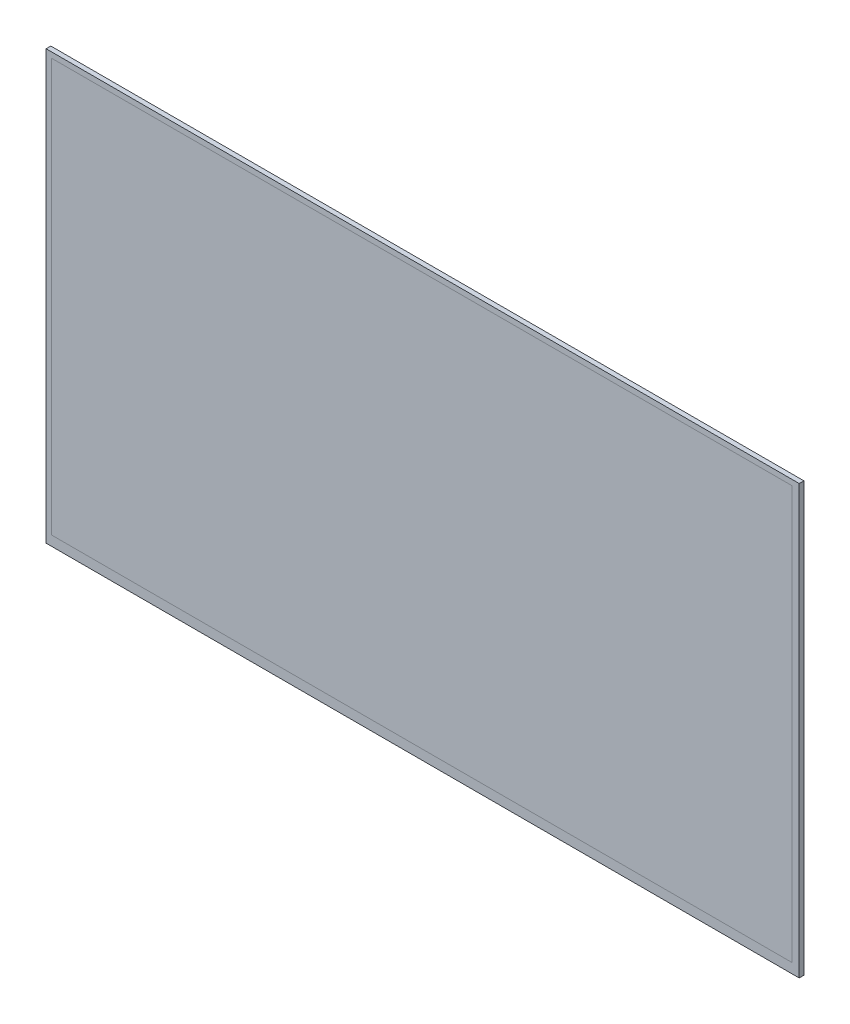
ISO-10303-21;
HEADER;
FILE_DESCRIPTION(('STEP AP214'),'2;1');
FILE_NAME('part.step','',(''),(''),'','','');
FILE_SCHEMA(('AUTOMOTIVE_DESIGN { 1 0 10303 214 1 1 1 1 }'));
ENDSEC;
DATA;
#1=APPLICATION_CONTEXT('core data for automotive mechanical design processes');
#2=APPLICATION_PROTOCOL_DEFINITION('international standard','automotive_design',2000,#1);
#3=PRODUCT_CONTEXT('',#1,'mechanical');
#4=PRODUCT('Part','Part','',(#3));
#5=PRODUCT_RELATED_PRODUCT_CATEGORY('part','',(#4));
#6=PRODUCT_DEFINITION_FORMATION('','',#4);
#7=PRODUCT_DEFINITION_CONTEXT('part definition',#1,'design');
#8=PRODUCT_DEFINITION('design','',#6,#7);
#9=PRODUCT_DEFINITION_SHAPE('','',#8);
#10=(LENGTH_UNIT() NAMED_UNIT(*) SI_UNIT(.MILLI.,.METRE.));
#11=(NAMED_UNIT(*) PLANE_ANGLE_UNIT() SI_UNIT($,.RADIAN.));
#12=(NAMED_UNIT(*) SI_UNIT($,.STERADIAN.) SOLID_ANGLE_UNIT());
#13=UNCERTAINTY_MEASURE_WITH_UNIT(LENGTH_MEASURE(1.E-05),#10,'distance_accuracy_value','');
#14=(GEOMETRIC_REPRESENTATION_CONTEXT(3) GLOBAL_UNCERTAINTY_ASSIGNED_CONTEXT((#13)) GLOBAL_UNIT_ASSIGNED_CONTEXT((#10,
#11,#12)) REPRESENTATION_CONTEXT('',''));
#15=CARTESIAN_POINT('',(0.,0.,0.));
#16=DIRECTION('',(0.,0.,1.));
#17=DIRECTION('',(1.,0.,0.));
#18=AXIS2_PLACEMENT_3D('',#15,#16,#17);
#19=CARTESIAN_POINT('',(-103.470930517839,-70.1245119393201,0.48));
#20=DIRECTION('',(0.,0.,1.));
#21=DIRECTION('',(1.,0.,0.));
#22=AXIS2_PLACEMENT_3D('',#19,#20,#21);
#23=PLANE('',#22);
#24=DIRECTION('',(0.,1.,0.));
#25=VECTOR('',#24,1.);
#26=CARTESIAN_POINT('',(50.6090694821613,15.7954880606799,0.48));
#27=LINE('',#26,#25);
#28=CARTESIAN_POINT('',(50.6090694821613,-70.1245119393201,0.48));
#29=VERTEX_POINT('',#28);
#30=CARTESIAN_POINT('',(50.6090694821613,15.7954880606799,0.48));
#31=VERTEX_POINT('',#30);
#32=EDGE_CURVE('P0_E96',#29,#31,#27,.T.);
#33=ORIENTED_EDGE('',*,*,#32,.T.);
#34=DIRECTION('',(1.,0.,0.));
#35=VECTOR('',#34,1.);
#36=CARTESIAN_POINT('',(-103.470930517839,15.7954880606799,0.48));
#37=LINE('',#36,#35);
#38=CARTESIAN_POINT('',(-103.470930517839,15.7954880606799,0.48));
#39=VERTEX_POINT('',#38);
#40=EDGE_CURVE('P0_E80',#31,#39,#37,.F.);
#41=ORIENTED_EDGE('',*,*,#40,.T.);
#42=DIRECTION('',(0.,1.,0.));
#43=VECTOR('',#42,1.);
#44=CARTESIAN_POINT('',(-103.470930517839,15.7954880606799,0.48));
#45=LINE('',#44,#43);
#46=CARTESIAN_POINT('',(-103.470930517839,-70.1245119393201,0.48));
#47=VERTEX_POINT('',#46);
#48=EDGE_CURVE('P0_E20',#39,#47,#45,.F.);
#49=ORIENTED_EDGE('',*,*,#48,.T.);
#50=DIRECTION('',(1.,0.,0.));
#51=VECTOR('',#50,1.);
#52=CARTESIAN_POINT('',(-103.470930517839,-70.1245119393201,0.48));
#53=LINE('',#52,#51);
#54=EDGE_CURVE('P0_E104',#47,#29,#53,.T.);
#55=ORIENTED_EDGE('',*,*,#54,.T.);
#56=EDGE_LOOP('',(#33,#41,#49,#55));
#57=FACE_BOUND('',#56,.T.);
#58=ADVANCED_FACE('P0_F17',(#57),#23,.T.);
#59=CARTESIAN_POINT('',(-103.470930517839,15.7954880606799,0.48));
#60=DIRECTION('',(-1.,0.,0.));
#61=DIRECTION('',(0.,0.,1.));
#62=AXIS2_PLACEMENT_3D('',#59,#60,#61);
#63=PLANE('',#62);
#64=DIRECTION('',(0.,0.,-1.));
#65=VECTOR('',#64,1.);
#66=CARTESIAN_POINT('',(-103.470930517839,-70.1245119393201,0.48));
#67=LINE('',#66,#65);
#68=CARTESIAN_POINT('',(-103.470930517839,-70.1245119393201,0.98));
#69=VERTEX_POINT('',#68);
#70=EDGE_CURVE('P0_E90',#69,#47,#67,.T.);
#71=ORIENTED_EDGE('',*,*,#70,.T.);
#72=ORIENTED_EDGE('',*,*,#48,.F.);
#73=DIRECTION('',(0.,0.,1.));
#74=VECTOR('',#73,1.);
#75=CARTESIAN_POINT('',(-103.470930517839,15.7954880606799,0.48));
#76=LINE('',#75,#74);
#77=CARTESIAN_POINT('',(-103.470930517839,15.7954880606799,0.98));
#78=VERTEX_POINT('',#77);
#79=EDGE_CURVE('P0_E88',#39,#78,#76,.T.);
#80=ORIENTED_EDGE('',*,*,#79,.T.);
#81=DIRECTION('',(0.,1.,0.));
#82=VECTOR('',#81,1.);
#83=CARTESIAN_POINT('',(-103.470930517839,-72.1645119393201,0.98));
#84=LINE('',#83,#82);
#85=EDGE_CURVE('P0_E109',#69,#78,#84,.T.);
#86=ORIENTED_EDGE('',*,*,#85,.F.);
#87=EDGE_LOOP('',(#71,#72,#80,#86));
#88=FACE_BOUND('',#87,.T.);
#89=ADVANCED_FACE('P0_F86',(#88),#63,.F.);
#90=CARTESIAN_POINT('',(-103.470930517839,15.7954880606799,0.48));
#91=DIRECTION('',(0.,1.,0.));
#92=DIRECTION('',(0.,0.,1.));
#93=AXIS2_PLACEMENT_3D('',#90,#91,#92);
#94=PLANE('',#93);
#95=ORIENTED_EDGE('',*,*,#79,.F.);
#96=ORIENTED_EDGE('',*,*,#40,.F.);
#97=DIRECTION('',(0.,0.,1.));
#98=VECTOR('',#97,1.);
#99=CARTESIAN_POINT('',(50.6090694821613,15.7954880606799,0.48));
#100=LINE('',#99,#98);
#101=CARTESIAN_POINT('',(50.6090694821613,15.7954880606799,0.98));
#102=VERTEX_POINT('',#101);
#103=EDGE_CURVE('P0_E101',#31,#102,#100,.T.);
#104=ORIENTED_EDGE('',*,*,#103,.T.);
#105=DIRECTION('',(1.,0.,0.));
#106=VECTOR('',#105,1.);
#107=CARTESIAN_POINT('',(-104.580930517839,15.7954880606799,0.98));
#108=LINE('',#107,#106);
#109=EDGE_CURVE('P0_E95',#78,#102,#108,.T.);
#110=ORIENTED_EDGE('',*,*,#109,.F.);
#111=EDGE_LOOP('',(#95,#96,#104,#110));
#112=FACE_BOUND('',#111,.T.);
#113=ADVANCED_FACE('P0_F94',(#112),#94,.F.);
#114=CARTESIAN_POINT('',(50.6090694821613,15.7954880606799,0.48));
#115=DIRECTION('',(1.,0.,0.));
#116=DIRECTION('',(0.,1.,0.));
#117=AXIS2_PLACEMENT_3D('',#114,#115,#116);
#118=PLANE('',#117);
#119=ORIENTED_EDGE('',*,*,#103,.F.);
#120=ORIENTED_EDGE('',*,*,#32,.F.);
#121=DIRECTION('',(0.,0.,-1.));
#122=VECTOR('',#121,1.);
#123=CARTESIAN_POINT('',(50.6090694821613,-70.1245119393201,0.48));
#124=LINE('',#123,#122);
#125=CARTESIAN_POINT('',(50.6090694821613,-70.1245119393201,0.98));
#126=VERTEX_POINT('',#125);
#127=EDGE_CURVE('P0_E106',#29,#126,#124,.F.);
#128=ORIENTED_EDGE('',*,*,#127,.T.);
#129=DIRECTION('',(0.,1.,0.));
#130=VECTOR('',#129,1.);
#131=CARTESIAN_POINT('',(50.6090694821613,-72.1645119393201,0.98));
#132=LINE('',#131,#130);
#133=EDGE_CURVE('P0_E112',#102,#126,#132,.F.);
#134=ORIENTED_EDGE('',*,*,#133,.F.);
#135=EDGE_LOOP('',(#119,#120,#128,#134));
#136=FACE_BOUND('',#135,.T.);
#137=ADVANCED_FACE('P0_F178',(#136),#118,.F.);
#138=CARTESIAN_POINT('',(-103.470930517839,-70.1245119393201,0.48));
#139=DIRECTION('',(0.,-1.,0.));
#140=DIRECTION('',(0.,0.,-1.));
#141=AXIS2_PLACEMENT_3D('',#138,#139,#140);
#142=PLANE('',#141);
#143=ORIENTED_EDGE('',*,*,#127,.F.);
#144=ORIENTED_EDGE('',*,*,#54,.F.);
#145=ORIENTED_EDGE('',*,*,#70,.F.);
#146=DIRECTION('',(1.,0.,0.));
#147=VECTOR('',#146,1.);
#148=CARTESIAN_POINT('',(-104.580930517839,-70.1245119393201,0.98));
#149=LINE('',#148,#147);
#150=EDGE_CURVE('P0_E114',#126,#69,#149,.F.);
#151=ORIENTED_EDGE('',*,*,#150,.F.);
#152=EDGE_LOOP('',(#143,#144,#145,#151));
#153=FACE_BOUND('',#152,.T.);
#154=ADVANCED_FACE('P0_F174',(#153),#142,.F.);
#155=CARTESIAN_POINT('',(-104.580930517839,-72.1645119393201,0.98));
#156=DIRECTION('',(0.,0.,1.));
#157=DIRECTION('',(1.,0.,0.));
#158=AXIS2_PLACEMENT_3D('',#155,#156,#157);
#159=PLANE('',#158);
#160=DIRECTION('',(0.,-1.,0.));
#161=VECTOR('',#160,1.);
#162=CARTESIAN_POINT('',(52.1190694821613,16.9354880606799,0.98));
#163=LINE('',#162,#161);
#164=CARTESIAN_POINT('',(52.1190694821613,-72.1645119393201,0.98));
#165=VERTEX_POINT('',#164);
#166=CARTESIAN_POINT('',(52.1190694821613,16.9354880606799,0.98));
#167=VERTEX_POINT('',#166);
#168=EDGE_CURVE('P0_E122',#165,#167,#163,.F.);
#169=ORIENTED_EDGE('',*,*,#168,.T.);
#170=DIRECTION('',(1.,0.,0.));
#171=VECTOR('',#170,1.);
#172=CARTESIAN_POINT('',(-104.580930517839,16.9354880606799,0.98));
#173=LINE('',#172,#171);
#174=CARTESIAN_POINT('',(-104.580930517839,16.9354880606799,0.98));
#175=VERTEX_POINT('',#174);
#176=EDGE_CURVE('P0_E127',#167,#175,#173,.F.);
#177=ORIENTED_EDGE('',*,*,#176,.T.);
#178=DIRECTION('',(0.,1.,0.));
#179=VECTOR('',#178,1.);
#180=CARTESIAN_POINT('',(-104.580930517839,16.9354880606799,0.98));
#181=LINE('',#180,#179);
#182=CARTESIAN_POINT('',(-104.580930517839,-72.1645119393201,0.98));
#183=VERTEX_POINT('',#182);
#184=EDGE_CURVE('P0_E130',#175,#183,#181,.F.);
#185=ORIENTED_EDGE('',*,*,#184,.T.);
#186=DIRECTION('',(1.,0.,0.));
#187=VECTOR('',#186,1.);
#188=CARTESIAN_POINT('',(-104.580930517839,-72.1645119393201,0.98));
#189=LINE('',#188,#187);
#190=EDGE_CURVE('P0_E117',#183,#165,#189,.T.);
#191=ORIENTED_EDGE('',*,*,#190,.T.);
#192=EDGE_LOOP('',(#169,#177,#185,#191));
#193=FACE_BOUND('',#192,.T.);
#194=ORIENTED_EDGE('',*,*,#133,.T.);
#195=ORIENTED_EDGE('',*,*,#150,.T.);
#196=ORIENTED_EDGE('',*,*,#85,.T.);
#197=ORIENTED_EDGE('',*,*,#109,.T.);
#198=EDGE_LOOP('',(#194,#195,#196,#197));
#199=FACE_BOUND('',#198,.T.);
#200=ADVANCED_FACE('P0_F171',(#193,#199),#159,.T.);
#201=CARTESIAN_POINT('',(-104.580930517839,-72.1645119393201,0.98));
#202=DIRECTION('',(0.,1.,0.));
#203=DIRECTION('',(0.,0.,1.));
#204=AXIS2_PLACEMENT_3D('',#201,#202,#203);
#205=PLANE('',#204);
#206=DIRECTION('',(0.,0.,1.));
#207=VECTOR('',#206,1.);
#208=CARTESIAN_POINT('',(52.1190694821613,-72.1645119393201,0.98));
#209=LINE('',#208,#207);
#210=CARTESIAN_POINT('',(52.1190694821613,-72.1645119393201,0.));
#211=VERTEX_POINT('',#210);
#212=EDGE_CURVE('P0_E119',#211,#165,#209,.T.);
#213=ORIENTED_EDGE('',*,*,#212,.T.);
#214=ORIENTED_EDGE('',*,*,#190,.F.);
#215=DIRECTION('',(0.,0.,1.));
#216=VECTOR('',#215,1.);
#217=CARTESIAN_POINT('',(-104.580930517839,-72.1645119393201,0.98));
#218=LINE('',#217,#216);
#219=CARTESIAN_POINT('',(-104.580930517839,-72.1645119393201,0.));
#220=VERTEX_POINT('',#219);
#221=EDGE_CURVE('P0_E133',#183,#220,#218,.F.);
#222=ORIENTED_EDGE('',*,*,#221,.T.);
#223=DIRECTION('',(1.,0.,0.));
#224=VECTOR('',#223,1.);
#225=CARTESIAN_POINT('',(-104.580930517839,-72.1645119393201,0.));
#226=LINE('',#225,#224);
#227=EDGE_CURVE('P0_E136',#220,#211,#226,.T.);
#228=ORIENTED_EDGE('',*,*,#227,.T.);
#229=EDGE_LOOP('',(#213,#214,#222,#228));
#230=FACE_BOUND('',#229,.T.);
#231=ADVANCED_FACE('P0_F154',(#230),#205,.F.);
#232=CARTESIAN_POINT('',(52.1190694821613,16.9354880606799,0.98));
#233=DIRECTION('',(-1.,0.,0.));
#234=DIRECTION('',(0.,-1.,0.));
#235=AXIS2_PLACEMENT_3D('',#232,#233,#234);
#236=PLANE('',#235);
#237=DIRECTION('',(0.,0.,-1.));
#238=VECTOR('',#237,1.);
#239=CARTESIAN_POINT('',(52.1190694821613,16.9354880606799,0.98));
#240=LINE('',#239,#238);
#241=CARTESIAN_POINT('',(52.1190694821613,16.9354880606799,0.));
#242=VERTEX_POINT('',#241);
#243=EDGE_CURVE('P0_E124',#242,#167,#240,.F.);
#244=ORIENTED_EDGE('',*,*,#243,.T.);
#245=ORIENTED_EDGE('',*,*,#168,.F.);
#246=ORIENTED_EDGE('',*,*,#212,.F.);
#247=DIRECTION('',(0.,1.,0.));
#248=VECTOR('',#247,1.);
#249=CARTESIAN_POINT('',(52.1190694821613,-72.1645119393201,0.));
#250=LINE('',#249,#248);
#251=EDGE_CURVE('P0_E139',#211,#242,#250,.T.);
#252=ORIENTED_EDGE('',*,*,#251,.T.);
#253=EDGE_LOOP('',(#244,#245,#246,#252));
#254=FACE_BOUND('',#253,.T.);
#255=ADVANCED_FACE('P0_F151',(#254),#236,.F.);
#256=CARTESIAN_POINT('',(-104.580930517839,16.9354880606799,0.98));
#257=DIRECTION('',(0.,-1.,0.));
#258=DIRECTION('',(0.,0.,-1.));
#259=AXIS2_PLACEMENT_3D('',#256,#257,#258);
#260=PLANE('',#259);
#261=DIRECTION('',(0.,0.,1.));
#262=VECTOR('',#261,1.);
#263=CARTESIAN_POINT('',(-104.580930517839,16.9354880606799,0.98));
#264=LINE('',#263,#262);
#265=CARTESIAN_POINT('',(-104.580930517839,16.9354880606799,0.));
#266=VERTEX_POINT('',#265);
#267=EDGE_CURVE('P0_E34',#266,#175,#264,.T.);
#268=ORIENTED_EDGE('',*,*,#267,.T.);
#269=ORIENTED_EDGE('',*,*,#176,.F.);
#270=ORIENTED_EDGE('',*,*,#243,.F.);
#271=DIRECTION('',(1.,0.,0.));
#272=VECTOR('',#271,1.);
#273=CARTESIAN_POINT('',(-104.580930517839,16.9354880606799,0.));
#274=LINE('',#273,#272);
#275=EDGE_CURVE('P0_E26',#242,#266,#274,.F.);
#276=ORIENTED_EDGE('',*,*,#275,.T.);
#277=EDGE_LOOP('',(#268,#269,#270,#276));
#278=FACE_BOUND('',#277,.T.);
#279=ADVANCED_FACE('P0_F145',(#278),#260,.F.);
#280=CARTESIAN_POINT('',(-104.580930517839,16.9354880606799,0.98));
#281=DIRECTION('',(1.,0.,0.));
#282=DIRECTION('',(0.,1.,0.));
#283=AXIS2_PLACEMENT_3D('',#280,#281,#282);
#284=PLANE('',#283);
#285=ORIENTED_EDGE('',*,*,#221,.F.);
#286=ORIENTED_EDGE('',*,*,#184,.F.);
#287=ORIENTED_EDGE('',*,*,#267,.F.);
#288=DIRECTION('',(0.,1.,0.));
#289=VECTOR('',#288,1.);
#290=CARTESIAN_POINT('',(-104.580930517839,-72.1645119393201,0.));
#291=LINE('',#290,#289);
#292=EDGE_CURVE('P0_E11',#266,#220,#291,.F.);
#293=ORIENTED_EDGE('',*,*,#292,.T.);
#294=EDGE_LOOP('',(#285,#286,#287,#293));
#295=FACE_BOUND('',#294,.T.);
#296=ADVANCED_FACE('P0_F156',(#295),#284,.F.);
#297=CARTESIAN_POINT('',(-104.580930517839,-72.1645119393201,0.));
#298=DIRECTION('',(0.,0.,1.));
#299=DIRECTION('',(1.,0.,0.));
#300=AXIS2_PLACEMENT_3D('',#297,#298,#299);
#301=PLANE('',#300);
#302=ORIENTED_EDGE('',*,*,#275,.F.);
#303=ORIENTED_EDGE('',*,*,#251,.F.);
#304=ORIENTED_EDGE('',*,*,#227,.F.);
#305=ORIENTED_EDGE('',*,*,#292,.F.);
#306=EDGE_LOOP('',(#302,#303,#304,#305));
#307=FACE_BOUND('',#306,.T.);
#308=ADVANCED_FACE('P0_F149',(#307),#301,.F.);
#309=CLOSED_SHELL('',(#58,#89,#113,#137,#154,#200,#231,#255,#279,#296,#308));
#310=MANIFOLD_SOLID_BREP('P0_B1',#309);
#311=CARTESIAN_POINT('',(-103.470930517839,-70.1245119393201,0.48));
#312=DIRECTION('',(0.,0.,1.));
#313=DIRECTION('',(1.,0.,0.));
#314=AXIS2_PLACEMENT_3D('',#311,#312,#313);
#315=PLANE('',#314);
#316=DIRECTION('',(1.,0.,0.));
#317=VECTOR('',#316,1.);
#318=CARTESIAN_POINT('',(-103.470930517839,15.7954880606799,0.48));
#319=LINE('',#318,#317);
#320=CARTESIAN_POINT('',(-103.470930517839,15.7954880606799,0.48));
#321=VERTEX_POINT('',#320);
#322=CARTESIAN_POINT('',(50.6090694821613,15.7954880606799,0.48));
#323=VERTEX_POINT('',#322);
#324=EDGE_CURVE('P1_E91',#321,#323,#319,.T.);
#325=ORIENTED_EDGE('',*,*,#324,.T.);
#326=DIRECTION('',(0.,1.,0.));
#327=VECTOR('',#326,1.);
#328=CARTESIAN_POINT('',(50.6090694821613,15.7954880606799,0.48));
#329=LINE('',#328,#327);
#330=CARTESIAN_POINT('',(50.6090694821613,-70.1245119393201,0.48));
#331=VERTEX_POINT('',#330);
#332=EDGE_CURVE('P1_E71',#323,#331,#329,.F.);
#333=ORIENTED_EDGE('',*,*,#332,.T.);
#334=DIRECTION('',(1.,0.,0.));
#335=VECTOR('',#334,1.);
#336=CARTESIAN_POINT('',(-103.470930517839,-70.1245119393201,0.48));
#337=LINE('',#336,#335);
#338=CARTESIAN_POINT('',(-103.470930517839,-70.1245119393201,0.48));
#339=VERTEX_POINT('',#338);
#340=EDGE_CURVE('P1_E57',#331,#339,#337,.F.);
#341=ORIENTED_EDGE('',*,*,#340,.T.);
#342=DIRECTION('',(0.,1.,0.));
#343=VECTOR('',#342,1.);
#344=CARTESIAN_POINT('',(-103.470930517839,15.7954880606799,0.48));
#345=LINE('',#344,#343);
#346=EDGE_CURVE('P1_E21',#339,#321,#345,.T.);
#347=ORIENTED_EDGE('',*,*,#346,.T.);
#348=EDGE_LOOP('',(#325,#333,#341,#347));
#349=FACE_BOUND('',#348,.T.);
#350=ADVANCED_FACE('P1_F18',(#349),#315,.F.);
#351=CARTESIAN_POINT('',(-103.470930517839,15.7954880606799,0.98));
#352=DIRECTION('',(1.,0.,0.));
#353=DIRECTION('',(0.,0.,-1.));
#354=AXIS2_PLACEMENT_3D('',#351,#352,#353);
#355=PLANE('',#354);
#356=DIRECTION('',(0.,0.,1.));
#357=VECTOR('',#356,1.);
#358=CARTESIAN_POINT('',(-103.470930517839,-70.1245119393201,0.98));
#359=LINE('',#358,#357);
#360=CARTESIAN_POINT('',(-103.470930517839,-70.1245119393201,0.98));
#361=VERTEX_POINT('',#360);
#362=EDGE_CURVE('P1_E63',#339,#361,#359,.T.);
#363=ORIENTED_EDGE('',*,*,#362,.T.);
#364=DIRECTION('',(0.,1.,0.));
#365=VECTOR('',#364,1.);
#366=CARTESIAN_POINT('',(-103.470930517839,-70.1245119393201,0.98));
#367=LINE('',#366,#365);
#368=CARTESIAN_POINT('',(-103.470930517839,15.7954880606799,0.98));
#369=VERTEX_POINT('',#368);
#370=EDGE_CURVE('P1_E94',#369,#361,#367,.F.);
#371=ORIENTED_EDGE('',*,*,#370,.F.);
#372=DIRECTION('',(0.,0.,-1.));
#373=VECTOR('',#372,1.);
#374=CARTESIAN_POINT('',(-103.470930517839,15.7954880606799,0.98));
#375=LINE('',#374,#373);
#376=EDGE_CURVE('P1_E66',#369,#321,#375,.T.);
#377=ORIENTED_EDGE('',*,*,#376,.T.);
#378=ORIENTED_EDGE('',*,*,#346,.F.);
#379=EDGE_LOOP('',(#363,#371,#377,#378));
#380=FACE_BOUND('',#379,.T.);
#381=ADVANCED_FACE('P1_F62',(#380),#355,.F.);
#382=CARTESIAN_POINT('',(-103.470930517839,-70.1245119393201,0.98));
#383=DIRECTION('',(0.,1.,0.));
#384=DIRECTION('',(0.,0.,1.));
#385=AXIS2_PLACEMENT_3D('',#382,#383,#384);
#386=PLANE('',#385);
#387=DIRECTION('',(0.,0.,1.));
#388=VECTOR('',#387,1.);
#389=CARTESIAN_POINT('',(50.6090694821613,-70.1245119393201,0.98));
#390=LINE('',#389,#388);
#391=CARTESIAN_POINT('',(50.6090694821613,-70.1245119393201,0.98));
#392=VERTEX_POINT('',#391);
#393=EDGE_CURVE('P1_E74',#331,#392,#390,.T.);
#394=ORIENTED_EDGE('',*,*,#393,.T.);
#395=DIRECTION('',(1.,0.,0.));
#396=VECTOR('',#395,1.);
#397=CARTESIAN_POINT('',(-103.470930517839,-70.1245119393201,0.98));
#398=LINE('',#397,#396);
#399=EDGE_CURVE('P1_E78',#361,#392,#398,.T.);
#400=ORIENTED_EDGE('',*,*,#399,.F.);
#401=ORIENTED_EDGE('',*,*,#362,.F.);
#402=ORIENTED_EDGE('',*,*,#340,.F.);
#403=EDGE_LOOP('',(#394,#400,#401,#402));
#404=FACE_BOUND('',#403,.T.);
#405=ADVANCED_FACE('P1_F76',(#404),#386,.F.);
#406=CARTESIAN_POINT('',(50.6090694821613,15.7954880606799,0.98));
#407=DIRECTION('',(-1.,0.,0.));
#408=DIRECTION('',(0.,0.,1.));
#409=AXIS2_PLACEMENT_3D('',#406,#407,#408);
#410=PLANE('',#409);
#411=DIRECTION('',(0.,0.,-1.));
#412=VECTOR('',#411,1.);
#413=CARTESIAN_POINT('',(50.6090694821613,15.7954880606799,0.98));
#414=LINE('',#413,#412);
#415=CARTESIAN_POINT('',(50.6090694821613,15.7954880606799,0.98));
#416=VERTEX_POINT('',#415);
#417=EDGE_CURVE('P1_E37',#323,#416,#414,.F.);
#418=ORIENTED_EDGE('',*,*,#417,.T.);
#419=DIRECTION('',(0.,1.,0.));
#420=VECTOR('',#419,1.);
#421=CARTESIAN_POINT('',(50.6090694821613,-70.1245119393201,0.98));
#422=LINE('',#421,#420);
#423=EDGE_CURVE('P1_E28',#392,#416,#422,.T.);
#424=ORIENTED_EDGE('',*,*,#423,.F.);
#425=ORIENTED_EDGE('',*,*,#393,.F.);
#426=ORIENTED_EDGE('',*,*,#332,.F.);
#427=EDGE_LOOP('',(#418,#424,#425,#426));
#428=FACE_BOUND('',#427,.T.);
#429=ADVANCED_FACE('P1_F103',(#428),#410,.F.);
#430=CARTESIAN_POINT('',(-103.470930517839,15.7954880606799,0.98));
#431=DIRECTION('',(0.,-1.,0.));
#432=DIRECTION('',(0.,0.,-1.));
#433=AXIS2_PLACEMENT_3D('',#430,#431,#432);
#434=PLANE('',#433);
#435=ORIENTED_EDGE('',*,*,#376,.F.);
#436=DIRECTION('',(1.,0.,0.));
#437=VECTOR('',#436,1.);
#438=CARTESIAN_POINT('',(-103.470930517839,15.7954880606799,0.98));
#439=LINE('',#438,#437);
#440=EDGE_CURVE('P1_E11',#416,#369,#439,.F.);
#441=ORIENTED_EDGE('',*,*,#440,.F.);
#442=ORIENTED_EDGE('',*,*,#417,.F.);
#443=ORIENTED_EDGE('',*,*,#324,.F.);
#444=EDGE_LOOP('',(#435,#441,#442,#443));
#445=FACE_BOUND('',#444,.T.);
#446=ADVANCED_FACE('P1_F105',(#445),#434,.F.);
#447=CARTESIAN_POINT('',(-103.470930517839,-70.1245119393201,0.98));
#448=DIRECTION('',(0.,0.,1.));
#449=DIRECTION('',(1.,0.,0.));
#450=AXIS2_PLACEMENT_3D('',#447,#448,#449);
#451=PLANE('',#450);
#452=ORIENTED_EDGE('',*,*,#423,.T.);
#453=ORIENTED_EDGE('',*,*,#440,.T.);
#454=ORIENTED_EDGE('',*,*,#370,.T.);
#455=ORIENTED_EDGE('',*,*,#399,.T.);
#456=EDGE_LOOP('',(#452,#453,#454,#455));
#457=FACE_BOUND('',#456,.T.);
#458=ADVANCED_FACE('P1_F102',(#457),#451,.T.);
#459=CLOSED_SHELL('',(#350,#381,#405,#429,#446,#458));
#460=MANIFOLD_SOLID_BREP('P1_B1',#459);
#461=ADVANCED_BREP_SHAPE_REPRESENTATION('',(#18,#310,#460),#14);
#462=SHAPE_DEFINITION_REPRESENTATION(#9,#461);
ENDSEC;
END-ISO-10303-21;
